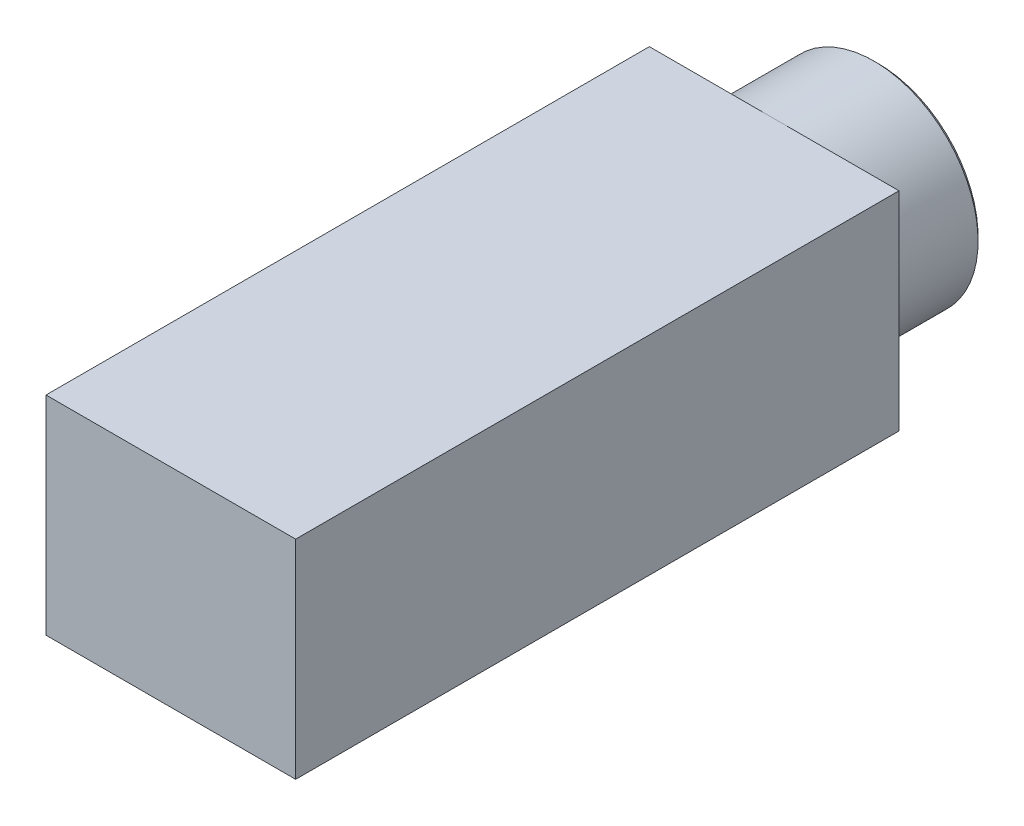
ISO-10303-21;
HEADER;
FILE_DESCRIPTION(('STEP AP214'),'2;1');
FILE_NAME('part.step','',(''),(''),'','','');
FILE_SCHEMA(('AUTOMOTIVE_DESIGN { 1 0 10303 214 1 1 1 1 }'));
ENDSEC;
DATA;
#1=APPLICATION_CONTEXT('core data for automotive mechanical design processes');
#2=APPLICATION_PROTOCOL_DEFINITION('international standard','automotive_design',2000,#1);
#3=PRODUCT_CONTEXT('',#1,'mechanical');
#4=PRODUCT('Part','Part','',(#3));
#5=PRODUCT_RELATED_PRODUCT_CATEGORY('part','',(#4));
#6=PRODUCT_DEFINITION_FORMATION('','',#4);
#7=PRODUCT_DEFINITION_CONTEXT('part definition',#1,'design');
#8=PRODUCT_DEFINITION('design','',#6,#7);
#9=PRODUCT_DEFINITION_SHAPE('','',#8);
#10=(LENGTH_UNIT() NAMED_UNIT(*) SI_UNIT(.MILLI.,.METRE.));
#11=(NAMED_UNIT(*) PLANE_ANGLE_UNIT() SI_UNIT($,.RADIAN.));
#12=(NAMED_UNIT(*) SI_UNIT($,.STERADIAN.) SOLID_ANGLE_UNIT());
#13=UNCERTAINTY_MEASURE_WITH_UNIT(LENGTH_MEASURE(1.E-05),#10,'distance_accuracy_value','');
#14=(GEOMETRIC_REPRESENTATION_CONTEXT(3) GLOBAL_UNCERTAINTY_ASSIGNED_CONTEXT((#13)) GLOBAL_UNIT_ASSIGNED_CONTEXT((#10,
#11,#12)) REPRESENTATION_CONTEXT('',''));
#15=CARTESIAN_POINT('',(0.,0.,0.));
#16=DIRECTION('',(0.,0.,1.));
#17=DIRECTION('',(1.,0.,0.));
#18=AXIS2_PLACEMENT_3D('',#15,#16,#17);
#19=CARTESIAN_POINT('',(0.,0.,0.));
#20=DIRECTION('',(0.,0.,1.));
#21=DIRECTION('',(1.,0.,0.));
#22=AXIS2_PLACEMENT_3D('',#19,#20,#21);
#23=PLANE('',#22);
#24=CARTESIAN_POINT('',(0.,0.,0.));
#25=DIRECTION('',(0.,0.,-1.));
#26=DIRECTION('',(-1.,0.,0.));
#27=AXIS2_PLACEMENT_3D('',#24,#25,#26);
#28=CIRCLE('',#27,2.5);
#29=CARTESIAN_POINT('',(0.,2.5,0.));
#30=VERTEX_POINT('',#29);
#31=CARTESIAN_POINT('',(0.,-2.5,0.));
#32=VERTEX_POINT('',#31);
#33=EDGE_CURVE('E102',#30,#32,#28,.T.);
#34=ORIENTED_EDGE('',*,*,#33,.F.);
#35=DIRECTION('',(-1.,0.,0.));
#36=VECTOR('',#35,1.);
#37=CARTESIAN_POINT('',(3.,2.5,0.));
#38=LINE('',#37,#36);
#39=CARTESIAN_POINT('',(3.,2.5,0.));
#40=VERTEX_POINT('',#39);
#41=EDGE_CURVE('E87',#40,#30,#38,.T.);
#42=ORIENTED_EDGE('',*,*,#41,.F.);
#43=DIRECTION('',(0.,1.,0.));
#44=VECTOR('',#43,1.);
#45=CARTESIAN_POINT('',(3.,-2.5,0.));
#46=LINE('',#45,#44);
#47=CARTESIAN_POINT('',(3.,-2.5,0.));
#48=VERTEX_POINT('',#47);
#49=EDGE_CURVE('E100',#48,#40,#46,.T.);
#50=ORIENTED_EDGE('',*,*,#49,.F.);
#51=DIRECTION('',(1.,0.,0.));
#52=VECTOR('',#51,1.);
#53=CARTESIAN_POINT('',(3.,-2.5,0.));
#54=LINE('',#53,#52);
#55=EDGE_CURVE('E103',#32,#48,#54,.T.);
#56=ORIENTED_EDGE('',*,*,#55,.F.);
#57=EDGE_LOOP('',(#34,#42,#50,#56));
#58=FACE_BOUND('',#57,.T.);
#59=ADVANCED_FACE('F32',(#58),#23,.F.);
#60=EDGE_CURVE('E47',#32,#30,#28,.T.);
#61=ORIENTED_EDGE('',*,*,#60,.F.);
#62=CARTESIAN_POINT('',(-3.,-2.5,0.));
#63=VERTEX_POINT('',#62);
#64=EDGE_CURVE('E124',#63,#32,#54,.T.);
#65=ORIENTED_EDGE('',*,*,#64,.F.);
#66=DIRECTION('',(0.,-1.,0.));
#67=VECTOR('',#66,1.);
#68=CARTESIAN_POINT('',(-3.,-2.5,0.));
#69=LINE('',#68,#67);
#70=CARTESIAN_POINT('',(-3.,2.5,0.));
#71=VERTEX_POINT('',#70);
#72=EDGE_CURVE('E99',#71,#63,#69,.T.);
#73=ORIENTED_EDGE('',*,*,#72,.F.);
#74=EDGE_CURVE('E75',#30,#71,#38,.T.);
#75=ORIENTED_EDGE('',*,*,#74,.F.);
#76=EDGE_LOOP('',(#61,#65,#73,#75));
#77=FACE_BOUND('',#76,.T.);
#78=ADVANCED_FACE('F97',(#77),#23,.F.);
#79=CARTESIAN_POINT('',(-3.,-2.5,14.5));
#80=DIRECTION('',(1.,0.,0.));
#81=DIRECTION('',(0.,0.,-1.));
#82=AXIS2_PLACEMENT_3D('',#79,#80,#81);
#83=PLANE('',#82);
#84=ORIENTED_EDGE('',*,*,#72,.T.);
#85=DIRECTION('',(0.,0.,-1.));
#86=VECTOR('',#85,1.);
#87=CARTESIAN_POINT('',(-3.,-2.5,14.5));
#88=LINE('',#87,#86);
#89=CARTESIAN_POINT('',(-3.,-2.5,14.5));
#90=VERTEX_POINT('',#89);
#91=EDGE_CURVE('E109',#90,#63,#88,.T.);
#92=ORIENTED_EDGE('',*,*,#91,.F.);
#93=DIRECTION('',(0.,-1.,0.));
#94=VECTOR('',#93,1.);
#95=CARTESIAN_POINT('',(-3.,-2.5,14.5));
#96=LINE('',#95,#94);
#97=CARTESIAN_POINT('',(-3.,2.5,14.5));
#98=VERTEX_POINT('',#97);
#99=EDGE_CURVE('E94',#98,#90,#96,.T.);
#100=ORIENTED_EDGE('',*,*,#99,.F.);
#101=DIRECTION('',(0.,0.,-1.));
#102=VECTOR('',#101,1.);
#103=CARTESIAN_POINT('',(-3.,2.5,14.5));
#104=LINE('',#103,#102);
#105=EDGE_CURVE('E122',#98,#71,#104,.T.);
#106=ORIENTED_EDGE('',*,*,#105,.T.);
#107=EDGE_LOOP('',(#84,#92,#100,#106));
#108=FACE_BOUND('',#107,.T.);
#109=ADVANCED_FACE('F137',(#108),#83,.F.);
#110=CARTESIAN_POINT('',(3.,-2.5,14.5));
#111=DIRECTION('',(0.,1.,0.));
#112=DIRECTION('',(0.,0.,1.));
#113=AXIS2_PLACEMENT_3D('',#110,#111,#112);
#114=PLANE('',#113);
#115=ORIENTED_EDGE('',*,*,#64,.T.);
#116=ORIENTED_EDGE('',*,*,#55,.T.);
#117=DIRECTION('',(0.,0.,-1.));
#118=VECTOR('',#117,1.);
#119=CARTESIAN_POINT('',(3.,-2.5,14.5));
#120=LINE('',#119,#118);
#121=CARTESIAN_POINT('',(3.,-2.5,14.5));
#122=VERTEX_POINT('',#121);
#123=EDGE_CURVE('E111',#122,#48,#120,.T.);
#124=ORIENTED_EDGE('',*,*,#123,.F.);
#125=DIRECTION('',(1.,0.,0.));
#126=VECTOR('',#125,1.);
#127=CARTESIAN_POINT('',(3.,-2.5,14.5));
#128=LINE('',#127,#126);
#129=EDGE_CURVE('E83',#90,#122,#128,.T.);
#130=ORIENTED_EDGE('',*,*,#129,.F.);
#131=ORIENTED_EDGE('',*,*,#91,.T.);
#132=EDGE_LOOP('',(#115,#116,#124,#130,#131));
#133=FACE_BOUND('',#132,.T.);
#134=ADVANCED_FACE('F133',(#133),#114,.F.);
#135=CARTESIAN_POINT('',(3.,-2.5,14.5));
#136=DIRECTION('',(-1.,0.,0.));
#137=DIRECTION('',(0.,0.,1.));
#138=AXIS2_PLACEMENT_3D('',#135,#136,#137);
#139=PLANE('',#138);
#140=ORIENTED_EDGE('',*,*,#49,.T.);
#141=DIRECTION('',(0.,0.,-1.));
#142=VECTOR('',#141,1.);
#143=CARTESIAN_POINT('',(3.,2.5,14.5));
#144=LINE('',#143,#142);
#145=CARTESIAN_POINT('',(3.,2.5,14.5));
#146=VERTEX_POINT('',#145);
#147=EDGE_CURVE('E90',#146,#40,#144,.T.);
#148=ORIENTED_EDGE('',*,*,#147,.F.);
#149=DIRECTION('',(0.,1.,0.));
#150=VECTOR('',#149,1.);
#151=CARTESIAN_POINT('',(3.,-2.5,14.5));
#152=LINE('',#151,#150);
#153=EDGE_CURVE('E119',#122,#146,#152,.T.);
#154=ORIENTED_EDGE('',*,*,#153,.F.);
#155=ORIENTED_EDGE('',*,*,#123,.T.);
#156=EDGE_LOOP('',(#140,#148,#154,#155));
#157=FACE_BOUND('',#156,.T.);
#158=ADVANCED_FACE('F132',(#157),#139,.F.);
#159=CARTESIAN_POINT('',(3.,2.5,14.5));
#160=DIRECTION('',(0.,-1.,0.));
#161=DIRECTION('',(0.,0.,-1.));
#162=AXIS2_PLACEMENT_3D('',#159,#160,#161);
#163=PLANE('',#162);
#164=ORIENTED_EDGE('',*,*,#41,.T.);
#165=ORIENTED_EDGE('',*,*,#74,.T.);
#166=ORIENTED_EDGE('',*,*,#105,.F.);
#167=DIRECTION('',(-1.,0.,0.));
#168=VECTOR('',#167,1.);
#169=CARTESIAN_POINT('',(3.,2.5,14.5));
#170=LINE('',#169,#168);
#171=EDGE_CURVE('E56',#146,#98,#170,.T.);
#172=ORIENTED_EDGE('',*,*,#171,.F.);
#173=ORIENTED_EDGE('',*,*,#147,.T.);
#174=EDGE_LOOP('',(#164,#165,#166,#172,#173));
#175=FACE_BOUND('',#174,.T.);
#176=ADVANCED_FACE('F88',(#175),#163,.F.);
#177=CARTESIAN_POINT('',(0.,0.,14.5));
#178=DIRECTION('',(0.,0.,1.));
#179=DIRECTION('',(1.,0.,0.));
#180=AXIS2_PLACEMENT_3D('',#177,#178,#179);
#181=PLANE('',#180);
#182=ORIENTED_EDGE('',*,*,#99,.T.);
#183=ORIENTED_EDGE('',*,*,#129,.T.);
#184=ORIENTED_EDGE('',*,*,#153,.T.);
#185=ORIENTED_EDGE('',*,*,#171,.T.);
#186=EDGE_LOOP('',(#182,#183,#184,#185));
#187=FACE_BOUND('',#186,.T.);
#188=ADVANCED_FACE('F138',(#187),#181,.T.);
#189=CARTESIAN_POINT('',(0.,0.,-2.5));
#190=DIRECTION('',(0.,0.,1.));
#191=DIRECTION('',(1.,0.,0.));
#192=AXIS2_PLACEMENT_3D('',#189,#190,#191);
#193=CYLINDRICAL_SURFACE('',#192,2.5);
#194=CARTESIAN_POINT('',(0.,0.,-2.39999999999999));
#195=DIRECTION('',(0.,0.,-1.));
#196=DIRECTION('',(-1.,0.,0.));
#197=AXIS2_PLACEMENT_3D('',#194,#195,#196);
#198=CIRCLE('',#197,2.5);
#199=CARTESIAN_POINT('',(-2.5,0.,-2.39999999999999));
#200=VERTEX_POINT('',#199);
#201=EDGE_CURVE('E11',#200,#200,#198,.F.);
#202=ORIENTED_EDGE('',*,*,#201,.T.);
#203=EDGE_LOOP('',(#202));
#204=FACE_BOUND('',#203,.T.);
#205=ORIENTED_EDGE('',*,*,#33,.T.);
#206=ORIENTED_EDGE('',*,*,#60,.T.);
#207=EDGE_LOOP('',(#205,#206));
#208=FACE_BOUND('',#207,.T.);
#209=ADVANCED_FACE('F108',(#204,#208),#193,.T.);
#210=CARTESIAN_POINT('',(0.,0.,-2.5));
#211=DIRECTION('',(0.,0.,-1.));
#212=DIRECTION('',(-1.,0.,0.));
#213=AXIS2_PLACEMENT_3D('',#210,#211,#212);
#214=PLANE('',#213);
#215=CARTESIAN_POINT('',(0.,0.,-2.5));
#216=DIRECTION('',(0.,0.,-1.));
#217=DIRECTION('',(-1.,0.,0.));
#218=AXIS2_PLACEMENT_3D('',#215,#216,#217);
#219=CIRCLE('',#218,2.39999999999999);
#220=CARTESIAN_POINT('',(-2.39999999999999,0.,-2.5));
#221=VERTEX_POINT('',#220);
#222=EDGE_CURVE('E40',#221,#221,#219,.T.);
#223=ORIENTED_EDGE('',*,*,#222,.T.);
#224=EDGE_LOOP('',(#223));
#225=FACE_BOUND('',#224,.T.);
#226=CARTESIAN_POINT('',(0.,0.,-2.5));
#227=DIRECTION('',(0.,0.,-1.));
#228=DIRECTION('',(-1.,0.,0.));
#229=AXIS2_PLACEMENT_3D('',#226,#227,#228);
#230=CIRCLE('',#229,1.8);
#231=CARTESIAN_POINT('',(-1.8,0.,-2.5));
#232=VERTEX_POINT('',#231);
#233=EDGE_CURVE('E115',#232,#232,#230,.T.);
#234=ORIENTED_EDGE('',*,*,#233,.F.);
#235=EDGE_LOOP('',(#234));
#236=FACE_BOUND('',#235,.T.);
#237=ADVANCED_FACE('F145',(#225,#236),#214,.T.);
#238=CARTESIAN_POINT('',(0.,0.,0.));
#239=DIRECTION('',(0.,0.,-1.));
#240=DIRECTION('',(-1.,0.,0.));
#241=AXIS2_PLACEMENT_3D('',#238,#239,#240);
#242=CYLINDRICAL_SURFACE('',#241,1.8);
#243=CARTESIAN_POINT('',(0.,0.,0.));
#244=DIRECTION('',(0.,0.,-1.));
#245=DIRECTION('',(-1.,0.,0.));
#246=AXIS2_PLACEMENT_3D('',#243,#244,#245);
#247=CIRCLE('',#246,1.8);
#248=CARTESIAN_POINT('',(-1.8,0.,0.));
#249=VERTEX_POINT('',#248);
#250=EDGE_CURVE('E106',#249,#249,#247,.T.);
#251=ORIENTED_EDGE('',*,*,#250,.F.);
#252=EDGE_LOOP('',(#251));
#253=FACE_BOUND('',#252,.T.);
#254=ORIENTED_EDGE('',*,*,#233,.T.);
#255=EDGE_LOOP('',(#254));
#256=FACE_BOUND('',#255,.T.);
#257=ADVANCED_FACE('F181',(#253,#256),#242,.F.);
#258=CARTESIAN_POINT('',(0.,0.,0.));
#259=DIRECTION('',(0.,0.,-1.));
#260=DIRECTION('',(-1.,0.,0.));
#261=AXIS2_PLACEMENT_3D('',#258,#259,#260);
#262=PLANE('',#261);
#263=ORIENTED_EDGE('',*,*,#250,.T.);
#264=EDGE_LOOP('',(#263));
#265=FACE_BOUND('',#264,.T.);
#266=ADVANCED_FACE('F186',(#265),#262,.T.);
#267=CARTESIAN_POINT('',(0.,0.,-2.5));
#268=DIRECTION('',(0.,0.,1.));
#269=DIRECTION('',(1.,0.,0.));
#270=AXIS2_PLACEMENT_3D('',#267,#268,#269);
#271=CONICAL_SURFACE('',#270,2.39999999999999,0.785398163397442);
#272=ORIENTED_EDGE('',*,*,#201,.F.);
#273=EDGE_LOOP('',(#272));
#274=FACE_BOUND('',#273,.T.);
#275=ORIENTED_EDGE('',*,*,#222,.F.);
#276=EDGE_LOOP('',(#275));
#277=FACE_BOUND('',#276,.T.);
#278=ADVANCED_FACE('F34',(#274,#277),#271,.T.);
#279=CLOSED_SHELL('',(#59,#78,#109,#134,#158,#176,#188,#209,#237,#257,#266,#278));
#280=MANIFOLD_SOLID_BREP('B2',#279);
#281=ADVANCED_BREP_SHAPE_REPRESENTATION('',(#18,#280),#14);
#282=SHAPE_DEFINITION_REPRESENTATION(#9,#281);
ENDSEC;
END-ISO-10303-21;
